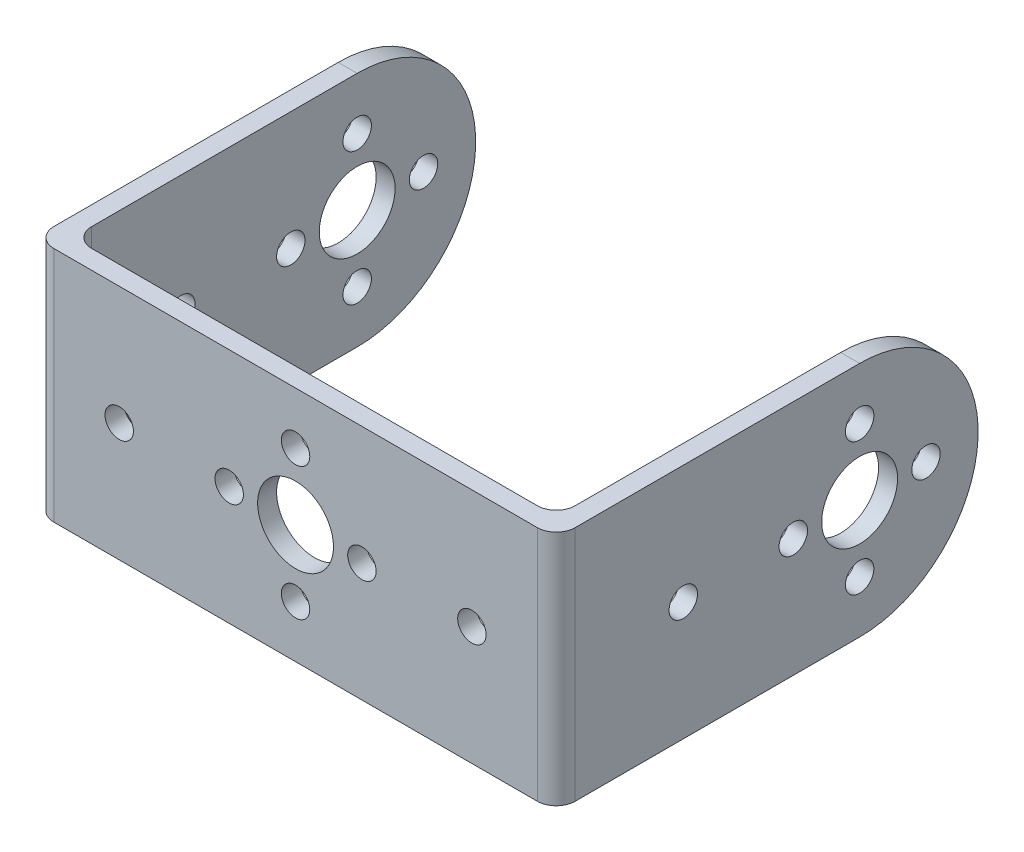
ISO-10303-21;
HEADER;
FILE_DESCRIPTION(('STEP AP214'),'2;1');
FILE_NAME('part.step','',(''),(''),'','','');
FILE_SCHEMA(('AUTOMOTIVE_DESIGN { 1 0 10303 214 1 1 1 1 }'));
ENDSEC;
DATA;
#1=APPLICATION_CONTEXT('core data for automotive mechanical design processes');
#2=APPLICATION_PROTOCOL_DEFINITION('international standard','automotive_design',2000,#1);
#3=PRODUCT_CONTEXT('',#1,'mechanical');
#4=PRODUCT('Part','Part','',(#3));
#5=PRODUCT_RELATED_PRODUCT_CATEGORY('part','',(#4));
#6=PRODUCT_DEFINITION_FORMATION('','',#4);
#7=PRODUCT_DEFINITION_CONTEXT('part definition',#1,'design');
#8=PRODUCT_DEFINITION('design','',#6,#7);
#9=PRODUCT_DEFINITION_SHAPE('','',#8);
#10=(LENGTH_UNIT() NAMED_UNIT(*) SI_UNIT(.MILLI.,.METRE.));
#11=(NAMED_UNIT(*) PLANE_ANGLE_UNIT() SI_UNIT($,.RADIAN.));
#12=(NAMED_UNIT(*) SI_UNIT($,.STERADIAN.) SOLID_ANGLE_UNIT());
#13=UNCERTAINTY_MEASURE_WITH_UNIT(LENGTH_MEASURE(1.E-05),#10,'distance_accuracy_value','');
#14=(GEOMETRIC_REPRESENTATION_CONTEXT(3) GLOBAL_UNCERTAINTY_ASSIGNED_CONTEXT((#13)) GLOBAL_UNIT_ASSIGNED_CONTEXT((#10,
#11,#12)) REPRESENTATION_CONTEXT('',''));
#15=CARTESIAN_POINT('',(0.,0.,0.));
#16=DIRECTION('',(0.,0.,1.));
#17=DIRECTION('',(1.,0.,0.));
#18=AXIS2_PLACEMENT_3D('',#15,#16,#17);
#19=CARTESIAN_POINT('',(-25.5,25.,-44.5));
#20=DIRECTION('',(1.,0.,0.));
#21=DIRECTION('',(0.,0.,-1.));
#22=AXIS2_PLACEMENT_3D('',#19,#20,#21);
#23=PLANE('',#22);
#24=CARTESIAN_POINT('',(-25.5,12.5,-32.));
#25=DIRECTION('',(1.,0.,0.));
#26=DIRECTION('',(0.,0.,-1.));
#27=AXIS2_PLACEMENT_3D('',#24,#25,#26);
#28=CIRCLE('',#27,4.00000000000001);
#29=CARTESIAN_POINT('',(-25.5,12.5,-36.));
#30=VERTEX_POINT('',#29);
#31=EDGE_CURVE('E322',#30,#30,#28,.F.);
#32=ORIENTED_EDGE('',*,*,#31,.T.);
#33=EDGE_LOOP('',(#32));
#34=FACE_BOUND('',#33,.T.);
#35=CARTESIAN_POINT('',(-25.5,19.5,-32.));
#36=DIRECTION('',(1.,0.,0.));
#37=DIRECTION('',(0.,0.,-1.));
#38=AXIS2_PLACEMENT_3D('',#35,#36,#37);
#39=CIRCLE('',#38,1.5);
#40=CARTESIAN_POINT('',(-25.5,19.5,-33.5));
#41=VERTEX_POINT('',#40);
#42=EDGE_CURVE('E319',#41,#41,#39,.F.);
#43=ORIENTED_EDGE('',*,*,#42,.T.);
#44=EDGE_LOOP('',(#43));
#45=FACE_BOUND('',#44,.T.);
#46=CARTESIAN_POINT('',(-25.5,12.5,-39.));
#47=DIRECTION('',(1.,0.,0.));
#48=DIRECTION('',(0.,0.,-1.));
#49=AXIS2_PLACEMENT_3D('',#46,#47,#48);
#50=CIRCLE('',#49,1.5);
#51=CARTESIAN_POINT('',(-25.5,12.5,-40.5));
#52=VERTEX_POINT('',#51);
#53=EDGE_CURVE('E316',#52,#52,#50,.F.);
#54=ORIENTED_EDGE('',*,*,#53,.T.);
#55=EDGE_LOOP('',(#54));
#56=FACE_BOUND('',#55,.T.);
#57=CARTESIAN_POINT('',(-25.5,5.5,-32.));
#58=DIRECTION('',(1.,0.,0.));
#59=DIRECTION('',(0.,0.,-1.));
#60=AXIS2_PLACEMENT_3D('',#57,#58,#59);
#61=CIRCLE('',#60,1.5);
#62=CARTESIAN_POINT('',(-25.5,5.5,-33.5));
#63=VERTEX_POINT('',#62);
#64=EDGE_CURVE('E299',#63,#63,#61,.F.);
#65=ORIENTED_EDGE('',*,*,#64,.T.);
#66=EDGE_LOOP('',(#65));
#67=FACE_BOUND('',#66,.T.);
#68=CARTESIAN_POINT('',(-25.5,12.5,-13.4));
#69=DIRECTION('',(1.,0.,0.));
#70=DIRECTION('',(0.,0.,-1.));
#71=AXIS2_PLACEMENT_3D('',#68,#69,#70);
#72=CIRCLE('',#71,1.5);
#73=CARTESIAN_POINT('',(-25.5,12.5,-14.9));
#74=VERTEX_POINT('',#73);
#75=EDGE_CURVE('E327',#74,#74,#72,.F.);
#76=ORIENTED_EDGE('',*,*,#75,.T.);
#77=EDGE_LOOP('',(#76));
#78=FACE_BOUND('',#77,.T.);
#79=CARTESIAN_POINT('',(-25.5,12.5,-25.));
#80=DIRECTION('',(1.,0.,0.));
#81=DIRECTION('',(0.,0.,-1.));
#82=AXIS2_PLACEMENT_3D('',#79,#80,#81);
#83=CIRCLE('',#82,1.5);
#84=CARTESIAN_POINT('',(-25.5,12.5,-26.5));
#85=VERTEX_POINT('',#84);
#86=EDGE_CURVE('E282',#85,#85,#83,.F.);
#87=ORIENTED_EDGE('',*,*,#86,.T.);
#88=EDGE_LOOP('',(#87));
#89=FACE_BOUND('',#88,.T.);
#90=DIRECTION('',(0.,0.,1.));
#91=VECTOR('',#90,1.);
#92=CARTESIAN_POINT('',(-25.5,25.,-44.5));
#93=LINE('',#92,#91);
#94=CARTESIAN_POINT('',(-25.5,25.,-32.));
#95=VERTEX_POINT('',#94);
#96=CARTESIAN_POINT('',(-25.5,25.,-4.));
#97=VERTEX_POINT('',#96);
#98=EDGE_CURVE('E273',#95,#97,#93,.T.);
#99=ORIENTED_EDGE('',*,*,#98,.T.);
#100=DIRECTION('',(0.,-1.,0.));
#101=VECTOR('',#100,1.);
#102=CARTESIAN_POINT('',(-25.5,25.,-4.));
#103=LINE('',#102,#101);
#104=CARTESIAN_POINT('',(-25.5,0.,-4.));
#105=VERTEX_POINT('',#104);
#106=EDGE_CURVE('E446',#97,#105,#103,.T.);
#107=ORIENTED_EDGE('',*,*,#106,.T.);
#108=DIRECTION('',(0.,0.,1.));
#109=VECTOR('',#108,1.);
#110=CARTESIAN_POINT('',(-25.5,0.,-44.5));
#111=LINE('',#110,#109);
#112=CARTESIAN_POINT('',(-25.5,0.,-32.));
#113=VERTEX_POINT('',#112);
#114=EDGE_CURVE('E330',#113,#105,#111,.T.);
#115=ORIENTED_EDGE('',*,*,#114,.F.);
#116=CARTESIAN_POINT('',(-25.5,12.5,-32.));
#117=DIRECTION('',(1.,0.,0.));
#118=DIRECTION('',(0.,0.,-1.));
#119=AXIS2_PLACEMENT_3D('',#116,#117,#118);
#120=CIRCLE('',#119,12.5);
#121=EDGE_CURVE('E325',#95,#113,#120,.F.);
#122=ORIENTED_EDGE('',*,*,#121,.F.);
#123=EDGE_LOOP('',(#99,#107,#115,#122));
#124=FACE_BOUND('',#123,.T.);
#125=ADVANCED_FACE('F178',(#34,#45,#56,#67,#78,#89,#124),#23,.T.);
#126=CARTESIAN_POINT('',(-27.5,25.,0.));
#127=DIRECTION('',(-1.,0.,0.));
#128=DIRECTION('',(0.,0.,1.));
#129=AXIS2_PLACEMENT_3D('',#126,#127,#128);
#130=PLANE('',#129);
#131=CARTESIAN_POINT('',(-27.5,12.5,-32.));
#132=DIRECTION('',(1.,0.,0.));
#133=DIRECTION('',(0.,0.,-1.));
#134=AXIS2_PLACEMENT_3D('',#131,#132,#133);
#135=CIRCLE('',#134,4.00000000000001);
#136=CARTESIAN_POINT('',(-27.5,12.5,-36.));
#137=VERTEX_POINT('',#136);
#138=EDGE_CURVE('E300',#137,#137,#135,.T.);
#139=ORIENTED_EDGE('',*,*,#138,.T.);
#140=EDGE_LOOP('',(#139));
#141=FACE_BOUND('',#140,.T.);
#142=CARTESIAN_POINT('',(-27.5,19.5,-32.));
#143=DIRECTION('',(1.,0.,0.));
#144=DIRECTION('',(0.,0.,-1.));
#145=AXIS2_PLACEMENT_3D('',#142,#143,#144);
#146=CIRCLE('',#145,1.5);
#147=CARTESIAN_POINT('',(-27.5,19.5,-33.5));
#148=VERTEX_POINT('',#147);
#149=EDGE_CURVE('E307',#148,#148,#146,.T.);
#150=ORIENTED_EDGE('',*,*,#149,.T.);
#151=EDGE_LOOP('',(#150));
#152=FACE_BOUND('',#151,.T.);
#153=CARTESIAN_POINT('',(-27.5,12.5,-39.));
#154=DIRECTION('',(1.,0.,0.));
#155=DIRECTION('',(0.,0.,-1.));
#156=AXIS2_PLACEMENT_3D('',#153,#154,#155);
#157=CIRCLE('',#156,1.5);
#158=CARTESIAN_POINT('',(-27.5,12.5,-40.5));
#159=VERTEX_POINT('',#158);
#160=EDGE_CURVE('E304',#159,#159,#157,.T.);
#161=ORIENTED_EDGE('',*,*,#160,.T.);
#162=EDGE_LOOP('',(#161));
#163=FACE_BOUND('',#162,.T.);
#164=CARTESIAN_POINT('',(-27.5,5.5,-32.));
#165=DIRECTION('',(1.,0.,0.));
#166=DIRECTION('',(0.,0.,-1.));
#167=AXIS2_PLACEMENT_3D('',#164,#165,#166);
#168=CIRCLE('',#167,1.5);
#169=CARTESIAN_POINT('',(-27.5,5.5,-33.5));
#170=VERTEX_POINT('',#169);
#171=EDGE_CURVE('E303',#170,#170,#168,.T.);
#172=ORIENTED_EDGE('',*,*,#171,.T.);
#173=EDGE_LOOP('',(#172));
#174=FACE_BOUND('',#173,.T.);
#175=CARTESIAN_POINT('',(-27.5,12.5,-13.4));
#176=DIRECTION('',(1.,0.,0.));
#177=DIRECTION('',(0.,0.,-1.));
#178=AXIS2_PLACEMENT_3D('',#175,#176,#177);
#179=CIRCLE('',#178,1.5);
#180=CARTESIAN_POINT('',(-27.5,12.5,-14.9));
#181=VERTEX_POINT('',#180);
#182=EDGE_CURVE('E297',#181,#181,#179,.T.);
#183=ORIENTED_EDGE('',*,*,#182,.T.);
#184=EDGE_LOOP('',(#183));
#185=FACE_BOUND('',#184,.T.);
#186=CARTESIAN_POINT('',(-27.5,12.5,-25.));
#187=DIRECTION('',(1.,0.,0.));
#188=DIRECTION('',(0.,0.,-1.));
#189=AXIS2_PLACEMENT_3D('',#186,#187,#188);
#190=CIRCLE('',#189,1.5);
#191=CARTESIAN_POINT('',(-27.5,12.5,-26.5));
#192=VERTEX_POINT('',#191);
#193=EDGE_CURVE('E286',#192,#192,#190,.T.);
#194=ORIENTED_EDGE('',*,*,#193,.T.);
#195=EDGE_LOOP('',(#194));
#196=FACE_BOUND('',#195,.T.);
#197=DIRECTION('',(0.,0.,-1.));
#198=VECTOR('',#197,1.);
#199=CARTESIAN_POINT('',(-27.5,0.,0.));
#200=LINE('',#199,#198);
#201=CARTESIAN_POINT('',(-27.5,0.,-2.));
#202=VERTEX_POINT('',#201);
#203=CARTESIAN_POINT('',(-27.5,0.,-32.));
#204=VERTEX_POINT('',#203);
#205=EDGE_CURVE('E331',#202,#204,#200,.T.);
#206=ORIENTED_EDGE('',*,*,#205,.F.);
#207=DIRECTION('',(0.,-1.,0.));
#208=VECTOR('',#207,1.);
#209=CARTESIAN_POINT('',(-27.5,25.,-2.));
#210=LINE('',#209,#208);
#211=CARTESIAN_POINT('',(-27.5,25.,-2.));
#212=VERTEX_POINT('',#211);
#213=EDGE_CURVE('E199',#202,#212,#210,.F.);
#214=ORIENTED_EDGE('',*,*,#213,.T.);
#215=DIRECTION('',(0.,0.,-1.));
#216=VECTOR('',#215,1.);
#217=CARTESIAN_POINT('',(-27.5,25.,0.));
#218=LINE('',#217,#216);
#219=CARTESIAN_POINT('',(-27.5,25.,-32.));
#220=VERTEX_POINT('',#219);
#221=EDGE_CURVE('E266',#212,#220,#218,.T.);
#222=ORIENTED_EDGE('',*,*,#221,.T.);
#223=CARTESIAN_POINT('',(-27.5,12.5,-32.));
#224=DIRECTION('',(1.,0.,0.));
#225=DIRECTION('',(0.,0.,-1.));
#226=AXIS2_PLACEMENT_3D('',#223,#224,#225);
#227=CIRCLE('',#226,12.5);
#228=EDGE_CURVE('E269',#204,#220,#227,.T.);
#229=ORIENTED_EDGE('',*,*,#228,.F.);
#230=EDGE_LOOP('',(#206,#214,#222,#229));
#231=FACE_BOUND('',#230,.T.);
#232=ADVANCED_FACE('F268',(#141,#152,#163,#174,#185,#196,#231),#130,.T.);
#233=CARTESIAN_POINT('',(27.5,25.,0.));
#234=DIRECTION('',(-1.,0.,0.));
#235=DIRECTION('',(0.,0.,1.));
#236=AXIS2_PLACEMENT_3D('',#233,#234,#235);
#237=PLANE('',#236);
#238=CARTESIAN_POINT('',(27.5,12.5,-32.));
#239=DIRECTION('',(1.,0.,0.));
#240=DIRECTION('',(0.,0.,-1.));
#241=AXIS2_PLACEMENT_3D('',#238,#239,#240);
#242=CIRCLE('',#241,4.00000000000001);
#243=CARTESIAN_POINT('',(27.5,12.5,-36.));
#244=VERTEX_POINT('',#243);
#245=EDGE_CURVE('E343',#244,#244,#242,.T.);
#246=ORIENTED_EDGE('',*,*,#245,.F.);
#247=EDGE_LOOP('',(#246));
#248=FACE_BOUND('',#247,.T.);
#249=CARTESIAN_POINT('',(27.5,19.5,-32.));
#250=DIRECTION('',(1.,0.,0.));
#251=DIRECTION('',(0.,0.,-1.));
#252=AXIS2_PLACEMENT_3D('',#249,#250,#251);
#253=CIRCLE('',#252,1.5);
#254=CARTESIAN_POINT('',(27.5,19.5,-33.5));
#255=VERTEX_POINT('',#254);
#256=EDGE_CURVE('E351',#255,#255,#253,.T.);
#257=ORIENTED_EDGE('',*,*,#256,.F.);
#258=EDGE_LOOP('',(#257));
#259=FACE_BOUND('',#258,.T.);
#260=CARTESIAN_POINT('',(27.5,12.5,-39.));
#261=DIRECTION('',(1.,0.,0.));
#262=DIRECTION('',(0.,0.,-1.));
#263=AXIS2_PLACEMENT_3D('',#260,#261,#262);
#264=CIRCLE('',#263,1.5);
#265=CARTESIAN_POINT('',(27.5,12.5,-40.5));
#266=VERTEX_POINT('',#265);
#267=EDGE_CURVE('E348',#266,#266,#264,.T.);
#268=ORIENTED_EDGE('',*,*,#267,.F.);
#269=EDGE_LOOP('',(#268));
#270=FACE_BOUND('',#269,.T.);
#271=CARTESIAN_POINT('',(27.5,5.5,-32.));
#272=DIRECTION('',(1.,0.,0.));
#273=DIRECTION('',(0.,0.,-1.));
#274=AXIS2_PLACEMENT_3D('',#271,#272,#273);
#275=CIRCLE('',#274,1.5);
#276=CARTESIAN_POINT('',(27.5,5.5,-33.5));
#277=VERTEX_POINT('',#276);
#278=EDGE_CURVE('E347',#277,#277,#275,.T.);
#279=ORIENTED_EDGE('',*,*,#278,.F.);
#280=EDGE_LOOP('',(#279));
#281=FACE_BOUND('',#280,.T.);
#282=CARTESIAN_POINT('',(27.5,12.5,-13.4));
#283=DIRECTION('',(1.,0.,0.));
#284=DIRECTION('',(0.,0.,-1.));
#285=AXIS2_PLACEMENT_3D('',#282,#283,#284);
#286=CIRCLE('',#285,1.5);
#287=CARTESIAN_POINT('',(27.5,12.5,-14.9));
#288=VERTEX_POINT('',#287);
#289=EDGE_CURVE('E339',#288,#288,#286,.T.);
#290=ORIENTED_EDGE('',*,*,#289,.F.);
#291=EDGE_LOOP('',(#290));
#292=FACE_BOUND('',#291,.T.);
#293=CARTESIAN_POINT('',(27.5,12.5,-25.));
#294=DIRECTION('',(1.,0.,0.));
#295=DIRECTION('',(0.,0.,-1.));
#296=AXIS2_PLACEMENT_3D('',#293,#294,#295);
#297=CIRCLE('',#296,1.5);
#298=CARTESIAN_POINT('',(27.5,12.5,-26.5));
#299=VERTEX_POINT('',#298);
#300=EDGE_CURVE('E272',#299,#299,#297,.T.);
#301=ORIENTED_EDGE('',*,*,#300,.F.);
#302=EDGE_LOOP('',(#301));
#303=FACE_BOUND('',#302,.T.);
#304=DIRECTION('',(0.,0.,-1.));
#305=VECTOR('',#304,1.);
#306=CARTESIAN_POINT('',(27.5,25.,0.));
#307=LINE('',#306,#305);
#308=CARTESIAN_POINT('',(27.5,25.,-2.));
#309=VERTEX_POINT('',#308);
#310=CARTESIAN_POINT('',(27.5,25.,-32.));
#311=VERTEX_POINT('',#310);
#312=EDGE_CURVE('E362',#309,#311,#307,.T.);
#313=ORIENTED_EDGE('',*,*,#312,.F.);
#314=DIRECTION('',(0.,-1.,0.));
#315=VECTOR('',#314,1.);
#316=CARTESIAN_POINT('',(27.5,25.,-2.));
#317=LINE('',#316,#315);
#318=CARTESIAN_POINT('',(27.5,0.,-2.));
#319=VERTEX_POINT('',#318);
#320=EDGE_CURVE('E430',#309,#319,#317,.T.);
#321=ORIENTED_EDGE('',*,*,#320,.T.);
#322=DIRECTION('',(0.,0.,-1.));
#323=VECTOR('',#322,1.);
#324=CARTESIAN_POINT('',(27.5,0.,0.));
#325=LINE('',#324,#323);
#326=CARTESIAN_POINT('',(27.5,0.,-32.));
#327=VERTEX_POINT('',#326);
#328=EDGE_CURVE('E374',#319,#327,#325,.T.);
#329=ORIENTED_EDGE('',*,*,#328,.T.);
#330=CARTESIAN_POINT('',(27.5,12.5,-32.));
#331=DIRECTION('',(1.,0.,0.));
#332=DIRECTION('',(0.,0.,-1.));
#333=AXIS2_PLACEMENT_3D('',#330,#331,#332);
#334=CIRCLE('',#333,12.5);
#335=EDGE_CURVE('E344',#327,#311,#334,.T.);
#336=ORIENTED_EDGE('',*,*,#335,.T.);
#337=EDGE_LOOP('',(#313,#321,#329,#336));
#338=FACE_BOUND('',#337,.T.);
#339=ADVANCED_FACE('F481',(#248,#259,#270,#281,#292,#303,#338),#237,.F.);
#340=CARTESIAN_POINT('',(25.5,25.,-44.5));
#341=DIRECTION('',(1.,0.,0.));
#342=DIRECTION('',(0.,0.,-1.));
#343=AXIS2_PLACEMENT_3D('',#340,#341,#342);
#344=PLANE('',#343);
#345=CARTESIAN_POINT('',(25.5,12.5,-32.));
#346=DIRECTION('',(1.,0.,0.));
#347=DIRECTION('',(0.,0.,-1.));
#348=AXIS2_PLACEMENT_3D('',#345,#346,#347);
#349=CIRCLE('',#348,4.00000000000001);
#350=CARTESIAN_POINT('',(25.5,12.5,-36.));
#351=VERTEX_POINT('',#350);
#352=EDGE_CURVE('E393',#351,#351,#349,.T.);
#353=ORIENTED_EDGE('',*,*,#352,.T.);
#354=EDGE_LOOP('',(#353));
#355=FACE_BOUND('',#354,.T.);
#356=CARTESIAN_POINT('',(25.5,19.5,-32.));
#357=DIRECTION('',(1.,0.,0.));
#358=DIRECTION('',(0.,0.,-1.));
#359=AXIS2_PLACEMENT_3D('',#356,#357,#358);
#360=CIRCLE('',#359,1.5);
#361=CARTESIAN_POINT('',(25.5,19.5,-33.5));
#362=VERTEX_POINT('',#361);
#363=EDGE_CURVE('E390',#362,#362,#360,.T.);
#364=ORIENTED_EDGE('',*,*,#363,.T.);
#365=EDGE_LOOP('',(#364));
#366=FACE_BOUND('',#365,.T.);
#367=CARTESIAN_POINT('',(25.5,12.5,-39.));
#368=DIRECTION('',(1.,0.,0.));
#369=DIRECTION('',(0.,0.,-1.));
#370=AXIS2_PLACEMENT_3D('',#367,#368,#369);
#371=CIRCLE('',#370,1.5);
#372=CARTESIAN_POINT('',(25.5,12.5,-40.5));
#373=VERTEX_POINT('',#372);
#374=EDGE_CURVE('E387',#373,#373,#371,.T.);
#375=ORIENTED_EDGE('',*,*,#374,.T.);
#376=EDGE_LOOP('',(#375));
#377=FACE_BOUND('',#376,.T.);
#378=CARTESIAN_POINT('',(25.5,5.5,-32.));
#379=DIRECTION('',(1.,0.,0.));
#380=DIRECTION('',(0.,0.,-1.));
#381=AXIS2_PLACEMENT_3D('',#378,#379,#380);
#382=CIRCLE('',#381,1.5);
#383=CARTESIAN_POINT('',(25.5,5.5,-33.5));
#384=VERTEX_POINT('',#383);
#385=EDGE_CURVE('E359',#384,#384,#382,.T.);
#386=ORIENTED_EDGE('',*,*,#385,.T.);
#387=EDGE_LOOP('',(#386));
#388=FACE_BOUND('',#387,.T.);
#389=CARTESIAN_POINT('',(25.5,12.5,-13.4));
#390=DIRECTION('',(1.,0.,0.));
#391=DIRECTION('',(0.,0.,-1.));
#392=AXIS2_PLACEMENT_3D('',#389,#390,#391);
#393=CIRCLE('',#392,1.5);
#394=CARTESIAN_POINT('',(25.5,12.5,-14.9));
#395=VERTEX_POINT('',#394);
#396=EDGE_CURVE('E375',#395,#395,#393,.T.);
#397=ORIENTED_EDGE('',*,*,#396,.T.);
#398=EDGE_LOOP('',(#397));
#399=FACE_BOUND('',#398,.T.);
#400=CARTESIAN_POINT('',(25.5,12.5,-25.));
#401=DIRECTION('',(1.,0.,0.));
#402=DIRECTION('',(0.,0.,-1.));
#403=AXIS2_PLACEMENT_3D('',#400,#401,#402);
#404=CIRCLE('',#403,1.5);
#405=CARTESIAN_POINT('',(25.5,12.5,-26.5));
#406=VERTEX_POINT('',#405);
#407=EDGE_CURVE('E338',#406,#406,#404,.T.);
#408=ORIENTED_EDGE('',*,*,#407,.T.);
#409=EDGE_LOOP('',(#408));
#410=FACE_BOUND('',#409,.T.);
#411=DIRECTION('',(0.,0.,1.));
#412=VECTOR('',#411,1.);
#413=CARTESIAN_POINT('',(25.5,0.,-44.5));
#414=LINE('',#413,#412);
#415=CARTESIAN_POINT('',(25.5,0.,-32.));
#416=VERTEX_POINT('',#415);
#417=CARTESIAN_POINT('',(25.5,0.,-4.));
#418=VERTEX_POINT('',#417);
#419=EDGE_CURVE('E377',#416,#418,#414,.T.);
#420=ORIENTED_EDGE('',*,*,#419,.T.);
#421=DIRECTION('',(0.,-1.,0.));
#422=VECTOR('',#421,1.);
#423=CARTESIAN_POINT('',(25.5,25.,-4.));
#424=LINE('',#423,#422);
#425=CARTESIAN_POINT('',(25.5,25.,-4.));
#426=VERTEX_POINT('',#425);
#427=EDGE_CURVE('E428',#418,#426,#424,.F.);
#428=ORIENTED_EDGE('',*,*,#427,.T.);
#429=DIRECTION('',(0.,0.,1.));
#430=VECTOR('',#429,1.);
#431=CARTESIAN_POINT('',(25.5,25.,-44.5));
#432=LINE('',#431,#430);
#433=CARTESIAN_POINT('',(25.5,25.,-32.));
#434=VERTEX_POINT('',#433);
#435=EDGE_CURVE('E365',#434,#426,#432,.T.);
#436=ORIENTED_EDGE('',*,*,#435,.F.);
#437=CARTESIAN_POINT('',(25.5,12.5,-32.));
#438=DIRECTION('',(1.,0.,0.));
#439=DIRECTION('',(0.,0.,-1.));
#440=AXIS2_PLACEMENT_3D('',#437,#438,#439);
#441=CIRCLE('',#440,12.5);
#442=EDGE_CURVE('E342',#416,#434,#441,.T.);
#443=ORIENTED_EDGE('',*,*,#442,.F.);
#444=EDGE_LOOP('',(#420,#428,#436,#443));
#445=FACE_BOUND('',#444,.T.);
#446=ADVANCED_FACE('F489',(#355,#366,#377,#388,#399,#410,#445),#344,.F.);
#447=CARTESIAN_POINT('',(0.,25.,0.));
#448=DIRECTION('',(0.,0.,-1.));
#449=DIRECTION('',(-1.,0.,0.));
#450=AXIS2_PLACEMENT_3D('',#447,#448,#449);
#451=PLANE('',#450);
#452=CARTESIAN_POINT('',(0.,19.5,0.));
#453=DIRECTION('',(0.,0.,1.));
#454=DIRECTION('',(1.,0.,0.));
#455=AXIS2_PLACEMENT_3D('',#452,#453,#454);
#456=CIRCLE('',#455,1.5);
#457=CARTESIAN_POINT('',(1.5,19.5,0.));
#458=VERTEX_POINT('',#457);
#459=EDGE_CURVE('E407',#458,#458,#456,.T.);
#460=ORIENTED_EDGE('',*,*,#459,.F.);
#461=EDGE_LOOP('',(#460));
#462=FACE_BOUND('',#461,.T.);
#463=CARTESIAN_POINT('',(18.6,12.5,0.));
#464=DIRECTION('',(0.,0.,1.));
#465=DIRECTION('',(1.,0.,0.));
#466=AXIS2_PLACEMENT_3D('',#463,#464,#465);
#467=CIRCLE('',#466,1.5);
#468=CARTESIAN_POINT('',(20.1,12.5,0.));
#469=VERTEX_POINT('',#468);
#470=EDGE_CURVE('E566',#469,#469,#467,.T.);
#471=ORIENTED_EDGE('',*,*,#470,.F.);
#472=EDGE_LOOP('',(#471));
#473=FACE_BOUND('',#472,.T.);
#474=CARTESIAN_POINT('',(0.,12.5,0.));
#475=DIRECTION('',(0.,0.,1.));
#476=DIRECTION('',(1.,0.,0.));
#477=AXIS2_PLACEMENT_3D('',#474,#475,#476);
#478=CIRCLE('',#477,4.);
#479=CARTESIAN_POINT('',(4.,12.5,0.));
#480=VERTEX_POINT('',#479);
#481=EDGE_CURVE('E570',#480,#480,#478,.T.);
#482=ORIENTED_EDGE('',*,*,#481,.F.);
#483=EDGE_LOOP('',(#482));
#484=FACE_BOUND('',#483,.T.);
#485=CARTESIAN_POINT('',(-18.6,12.5,0.));
#486=DIRECTION('',(0.,0.,1.));
#487=DIRECTION('',(1.,0.,0.));
#488=AXIS2_PLACEMENT_3D('',#485,#486,#487);
#489=CIRCLE('',#488,1.5);
#490=CARTESIAN_POINT('',(-17.1,12.5,0.));
#491=VERTEX_POINT('',#490);
#492=EDGE_CURVE('E294',#491,#491,#489,.T.);
#493=ORIENTED_EDGE('',*,*,#492,.F.);
#494=EDGE_LOOP('',(#493));
#495=FACE_BOUND('',#494,.T.);
#496=CARTESIAN_POINT('',(-7.,12.5,0.));
#497=DIRECTION('',(0.,0.,1.));
#498=DIRECTION('',(1.,0.,0.));
#499=AXIS2_PLACEMENT_3D('',#496,#497,#498);
#500=CIRCLE('',#499,1.5);
#501=CARTESIAN_POINT('',(-5.5,12.5,0.));
#502=VERTEX_POINT('',#501);
#503=EDGE_CURVE('E577',#502,#502,#500,.T.);
#504=ORIENTED_EDGE('',*,*,#503,.F.);
#505=EDGE_LOOP('',(#504));
#506=FACE_BOUND('',#505,.T.);
#507=CARTESIAN_POINT('',(0.,5.5,0.));
#508=DIRECTION('',(0.,0.,1.));
#509=DIRECTION('',(1.,0.,0.));
#510=AXIS2_PLACEMENT_3D('',#507,#508,#509);
#511=CIRCLE('',#510,1.5);
#512=CARTESIAN_POINT('',(1.5,5.5,0.));
#513=VERTEX_POINT('',#512);
#514=EDGE_CURVE('E581',#513,#513,#511,.T.);
#515=ORIENTED_EDGE('',*,*,#514,.F.);
#516=EDGE_LOOP('',(#515));
#517=FACE_BOUND('',#516,.T.);
#518=CARTESIAN_POINT('',(7.,12.5,0.));
#519=DIRECTION('',(0.,0.,1.));
#520=DIRECTION('',(1.,0.,0.));
#521=AXIS2_PLACEMENT_3D('',#518,#519,#520);
#522=CIRCLE('',#521,1.5);
#523=CARTESIAN_POINT('',(8.5,12.5,0.));
#524=VERTEX_POINT('',#523);
#525=EDGE_CURVE('E584',#524,#524,#522,.T.);
#526=ORIENTED_EDGE('',*,*,#525,.F.);
#527=EDGE_LOOP('',(#526));
#528=FACE_BOUND('',#527,.T.);
#529=DIRECTION('',(1.,0.,0.));
#530=VECTOR('',#529,1.);
#531=CARTESIAN_POINT('',(0.,0.,0.));
#532=LINE('',#531,#530);
#533=CARTESIAN_POINT('',(-25.5,0.,0.));
#534=VERTEX_POINT('',#533);
#535=CARTESIAN_POINT('',(25.5,0.,0.));
#536=VERTEX_POINT('',#535);
#537=EDGE_CURVE('E371',#534,#536,#532,.T.);
#538=ORIENTED_EDGE('',*,*,#537,.T.);
#539=DIRECTION('',(0.,-1.,0.));
#540=VECTOR('',#539,1.);
#541=CARTESIAN_POINT('',(25.5,25.,0.));
#542=LINE('',#541,#540);
#543=CARTESIAN_POINT('',(25.5,25.,0.));
#544=VERTEX_POINT('',#543);
#545=EDGE_CURVE('E440',#536,#544,#542,.F.);
#546=ORIENTED_EDGE('',*,*,#545,.T.);
#547=DIRECTION('',(1.,0.,0.));
#548=VECTOR('',#547,1.);
#549=CARTESIAN_POINT('',(0.,25.,0.));
#550=LINE('',#549,#548);
#551=CARTESIAN_POINT('',(-25.5,25.,0.));
#552=VERTEX_POINT('',#551);
#553=EDGE_CURVE('E360',#552,#544,#550,.T.);
#554=ORIENTED_EDGE('',*,*,#553,.F.);
#555=DIRECTION('',(0.,-1.,0.));
#556=VECTOR('',#555,1.);
#557=CARTESIAN_POINT('',(-25.5,0.,0.));
#558=LINE('',#557,#556);
#559=EDGE_CURVE('E437',#552,#534,#558,.T.);
#560=ORIENTED_EDGE('',*,*,#559,.T.);
#561=EDGE_LOOP('',(#538,#546,#554,#560));
#562=FACE_BOUND('',#561,.T.);
#563=ADVANCED_FACE('F473',(#462,#473,#484,#495,#506,#517,#528,#562),#451,.F.);
#564=CARTESIAN_POINT('',(25.5,25.,-2.));
#565=DIRECTION('',(0.,0.,1.));
#566=DIRECTION('',(1.,0.,0.));
#567=AXIS2_PLACEMENT_3D('',#564,#565,#566);
#568=PLANE('',#567);
#569=CARTESIAN_POINT('',(0.,19.5,-2.));
#570=DIRECTION('',(0.,0.,1.));
#571=DIRECTION('',(1.,0.,0.));
#572=AXIS2_PLACEMENT_3D('',#569,#570,#571);
#573=CIRCLE('',#572,1.5);
#574=CARTESIAN_POINT('',(1.5,19.5,-2.));
#575=VERTEX_POINT('',#574);
#576=EDGE_CURVE('E291',#575,#575,#573,.T.);
#577=ORIENTED_EDGE('',*,*,#576,.T.);
#578=EDGE_LOOP('',(#577));
#579=FACE_BOUND('',#578,.T.);
#580=CARTESIAN_POINT('',(18.6,12.5,-2.));
#581=DIRECTION('',(0.,0.,1.));
#582=DIRECTION('',(1.,0.,0.));
#583=AXIS2_PLACEMENT_3D('',#580,#581,#582);
#584=CIRCLE('',#583,1.5);
#585=CARTESIAN_POINT('',(20.1,12.5,-2.));
#586=VERTEX_POINT('',#585);
#587=EDGE_CURVE('E419',#586,#586,#584,.T.);
#588=ORIENTED_EDGE('',*,*,#587,.T.);
#589=EDGE_LOOP('',(#588));
#590=FACE_BOUND('',#589,.T.);
#591=CARTESIAN_POINT('',(0.,12.5,-2.));
#592=DIRECTION('',(0.,0.,1.));
#593=DIRECTION('',(1.,0.,0.));
#594=AXIS2_PLACEMENT_3D('',#591,#592,#593);
#595=CIRCLE('',#594,4.);
#596=CARTESIAN_POINT('',(4.,12.5,-2.));
#597=VERTEX_POINT('',#596);
#598=EDGE_CURVE('E416',#597,#597,#595,.T.);
#599=ORIENTED_EDGE('',*,*,#598,.T.);
#600=EDGE_LOOP('',(#599));
#601=FACE_BOUND('',#600,.T.);
#602=CARTESIAN_POINT('',(-18.6,12.5,-1.99999999999999));
#603=DIRECTION('',(0.,0.,1.));
#604=DIRECTION('',(1.,0.,0.));
#605=AXIS2_PLACEMENT_3D('',#602,#603,#604);
#606=CIRCLE('',#605,1.5);
#607=CARTESIAN_POINT('',(-17.1,12.5,-1.99999999999999));
#608=VERTEX_POINT('',#607);
#609=EDGE_CURVE('E413',#608,#608,#606,.T.);
#610=ORIENTED_EDGE('',*,*,#609,.T.);
#611=EDGE_LOOP('',(#610));
#612=FACE_BOUND('',#611,.T.);
#613=CARTESIAN_POINT('',(-7.,12.5,-2.));
#614=DIRECTION('',(0.,0.,1.));
#615=DIRECTION('',(1.,0.,0.));
#616=AXIS2_PLACEMENT_3D('',#613,#614,#615);
#617=CIRCLE('',#616,1.5);
#618=CARTESIAN_POINT('',(-5.5,12.5,-2.));
#619=VERTEX_POINT('',#618);
#620=EDGE_CURVE('E410',#619,#619,#617,.T.);
#621=ORIENTED_EDGE('',*,*,#620,.T.);
#622=EDGE_LOOP('',(#621));
#623=FACE_BOUND('',#622,.T.);
#624=CARTESIAN_POINT('',(0.,5.5,-2.));
#625=DIRECTION('',(0.,0.,1.));
#626=DIRECTION('',(1.,0.,0.));
#627=AXIS2_PLACEMENT_3D('',#624,#625,#626);
#628=CIRCLE('',#627,1.5);
#629=CARTESIAN_POINT('',(1.5,5.5,-2.));
#630=VERTEX_POINT('',#629);
#631=EDGE_CURVE('E406',#630,#630,#628,.T.);
#632=ORIENTED_EDGE('',*,*,#631,.T.);
#633=EDGE_LOOP('',(#632));
#634=FACE_BOUND('',#633,.T.);
#635=CARTESIAN_POINT('',(7.,12.5,-2.));
#636=DIRECTION('',(0.,0.,1.));
#637=DIRECTION('',(1.,0.,0.));
#638=AXIS2_PLACEMENT_3D('',#635,#636,#637);
#639=CIRCLE('',#638,1.5);
#640=CARTESIAN_POINT('',(8.5,12.5,-2.));
#641=VERTEX_POINT('',#640);
#642=EDGE_CURVE('E403',#641,#641,#639,.T.);
#643=ORIENTED_EDGE('',*,*,#642,.T.);
#644=EDGE_LOOP('',(#643));
#645=FACE_BOUND('',#644,.T.);
#646=DIRECTION('',(-1.,0.,0.));
#647=VECTOR('',#646,1.);
#648=CARTESIAN_POINT('',(25.5,25.,-2.));
#649=LINE('',#648,#647);
#650=CARTESIAN_POINT('',(23.5,25.,-2.));
#651=VERTEX_POINT('',#650);
#652=CARTESIAN_POINT('',(-23.5,25.,-2.));
#653=VERTEX_POINT('',#652);
#654=EDGE_CURVE('E368',#651,#653,#649,.T.);
#655=ORIENTED_EDGE('',*,*,#654,.F.);
#656=DIRECTION('',(0.,-1.,0.));
#657=VECTOR('',#656,1.);
#658=CARTESIAN_POINT('',(23.5,0.,-2.));
#659=LINE('',#658,#657);
#660=CARTESIAN_POINT('',(23.5,0.,-2.));
#661=VERTEX_POINT('',#660);
#662=EDGE_CURVE('E425',#651,#661,#659,.T.);
#663=ORIENTED_EDGE('',*,*,#662,.T.);
#664=DIRECTION('',(-1.,0.,0.));
#665=VECTOR('',#664,1.);
#666=CARTESIAN_POINT('',(25.5,0.,-2.));
#667=LINE('',#666,#665);
#668=CARTESIAN_POINT('',(-23.5,0.,-2.));
#669=VERTEX_POINT('',#668);
#670=EDGE_CURVE('E363',#661,#669,#667,.T.);
#671=ORIENTED_EDGE('',*,*,#670,.T.);
#672=DIRECTION('',(0.,-1.,0.));
#673=VECTOR('',#672,1.);
#674=CARTESIAN_POINT('',(-23.5,25.,-2.));
#675=LINE('',#674,#673);
#676=EDGE_CURVE('E400',#669,#653,#675,.F.);
#677=ORIENTED_EDGE('',*,*,#676,.T.);
#678=EDGE_LOOP('',(#655,#663,#671,#677));
#679=FACE_BOUND('',#678,.T.);
#680=ADVANCED_FACE('F463',(#579,#590,#601,#612,#623,#634,#645,#679),#568,.F.);
#681=CARTESIAN_POINT('',(0.,25.,0.));
#682=DIRECTION('',(0.,1.,0.));
#683=DIRECTION('',(0.,0.,1.));
#684=AXIS2_PLACEMENT_3D('',#681,#682,#683);
#685=PLANE('',#684);
#686=ORIENTED_EDGE('',*,*,#553,.T.);
#687=CARTESIAN_POINT('',(25.5,25.,-2.));
#688=DIRECTION('',(0.,1.,0.));
#689=DIRECTION('',(0.,0.,1.));
#690=AXIS2_PLACEMENT_3D('',#687,#688,#689);
#691=CIRCLE('',#690,2.);
#692=EDGE_CURVE('E444',#544,#309,#691,.T.);
#693=ORIENTED_EDGE('',*,*,#692,.T.);
#694=ORIENTED_EDGE('',*,*,#312,.T.);
#695=DIRECTION('',(1.,0.,0.));
#696=VECTOR('',#695,1.);
#697=CARTESIAN_POINT('',(2.5,25.,-32.));
#698=LINE('',#697,#696);
#699=EDGE_CURVE('E370',#434,#311,#698,.T.);
#700=ORIENTED_EDGE('',*,*,#699,.F.);
#701=ORIENTED_EDGE('',*,*,#435,.T.);
#702=CARTESIAN_POINT('',(23.5,25.,-4.));
#703=DIRECTION('',(0.,1.,0.));
#704=DIRECTION('',(0.,0.,1.));
#705=AXIS2_PLACEMENT_3D('',#702,#703,#704);
#706=CIRCLE('',#705,2.);
#707=EDGE_CURVE('E452',#426,#651,#706,.F.);
#708=ORIENTED_EDGE('',*,*,#707,.T.);
#709=ORIENTED_EDGE('',*,*,#654,.T.);
#710=CARTESIAN_POINT('',(-23.5,25.,-4.));
#711=DIRECTION('',(0.,1.,0.));
#712=DIRECTION('',(0.,0.,1.));
#713=AXIS2_PLACEMENT_3D('',#710,#711,#712);
#714=CIRCLE('',#713,2.);
#715=EDGE_CURVE('E12',#653,#97,#714,.F.);
#716=ORIENTED_EDGE('',*,*,#715,.T.);
#717=ORIENTED_EDGE('',*,*,#98,.F.);
#718=DIRECTION('',(-1.,0.,0.));
#719=VECTOR('',#718,1.);
#720=CARTESIAN_POINT('',(-2.5,25.,-32.));
#721=LINE('',#720,#719);
#722=EDGE_CURVE('E279',#95,#220,#721,.T.);
#723=ORIENTED_EDGE('',*,*,#722,.T.);
#724=ORIENTED_EDGE('',*,*,#221,.F.);
#725=CARTESIAN_POINT('',(-25.5,25.,-2.));
#726=DIRECTION('',(0.,1.,0.));
#727=DIRECTION('',(0.,0.,1.));
#728=AXIS2_PLACEMENT_3D('',#725,#726,#727);
#729=CIRCLE('',#728,2.);
#730=EDGE_CURVE('E442',#212,#552,#729,.T.);
#731=ORIENTED_EDGE('',*,*,#730,.T.);
#732=EDGE_LOOP('',(#686,#693,#694,#700,#701,#708,#709,#716,#717,#723,#724,#731));
#733=FACE_BOUND('',#732,.T.);
#734=ADVANCED_FACE('F285',(#733),#685,.T.);
#735=CARTESIAN_POINT('',(0.,0.,0.));
#736=DIRECTION('',(0.,1.,0.));
#737=DIRECTION('',(0.,0.,1.));
#738=AXIS2_PLACEMENT_3D('',#735,#736,#737);
#739=PLANE('',#738);
#740=ORIENTED_EDGE('',*,*,#328,.F.);
#741=CARTESIAN_POINT('',(25.5,0.,-2.));
#742=DIRECTION('',(0.,1.,0.));
#743=DIRECTION('',(0.,0.,1.));
#744=AXIS2_PLACEMENT_3D('',#741,#742,#743);
#745=CIRCLE('',#744,2.);
#746=EDGE_CURVE('E435',#319,#536,#745,.F.);
#747=ORIENTED_EDGE('',*,*,#746,.T.);
#748=ORIENTED_EDGE('',*,*,#537,.F.);
#749=CARTESIAN_POINT('',(-25.5,0.,-2.));
#750=DIRECTION('',(0.,1.,0.));
#751=DIRECTION('',(0.,0.,1.));
#752=AXIS2_PLACEMENT_3D('',#749,#750,#751);
#753=CIRCLE('',#752,2.);
#754=EDGE_CURVE('E433',#534,#202,#753,.F.);
#755=ORIENTED_EDGE('',*,*,#754,.T.);
#756=ORIENTED_EDGE('',*,*,#205,.T.);
#757=DIRECTION('',(-1.,0.,0.));
#758=VECTOR('',#757,1.);
#759=CARTESIAN_POINT('',(-2.5,0.,-32.));
#760=LINE('',#759,#758);
#761=EDGE_CURVE('E281',#113,#204,#760,.T.);
#762=ORIENTED_EDGE('',*,*,#761,.F.);
#763=ORIENTED_EDGE('',*,*,#114,.T.);
#764=CARTESIAN_POINT('',(-23.5,0.,-4.));
#765=DIRECTION('',(0.,1.,0.));
#766=DIRECTION('',(0.,0.,1.));
#767=AXIS2_PLACEMENT_3D('',#764,#765,#766);
#768=CIRCLE('',#767,2.);
#769=EDGE_CURVE('E186',#105,#669,#768,.T.);
#770=ORIENTED_EDGE('',*,*,#769,.T.);
#771=ORIENTED_EDGE('',*,*,#670,.F.);
#772=CARTESIAN_POINT('',(23.5,0.,-4.));
#773=DIRECTION('',(0.,1.,0.));
#774=DIRECTION('',(0.,0.,1.));
#775=AXIS2_PLACEMENT_3D('',#772,#773,#774);
#776=CIRCLE('',#775,2.);
#777=EDGE_CURVE('E450',#661,#418,#776,.T.);
#778=ORIENTED_EDGE('',*,*,#777,.T.);
#779=ORIENTED_EDGE('',*,*,#419,.F.);
#780=DIRECTION('',(1.,0.,0.));
#781=VECTOR('',#780,1.);
#782=CARTESIAN_POINT('',(2.5,0.,-32.));
#783=LINE('',#782,#781);
#784=EDGE_CURVE('E384',#416,#327,#783,.T.);
#785=ORIENTED_EDGE('',*,*,#784,.T.);
#786=EDGE_LOOP('',(#740,#747,#748,#755,#756,#762,#763,#770,#771,#778,#779,#785));
#787=FACE_BOUND('',#786,.T.);
#788=ADVANCED_FACE('F456',(#787),#739,.F.);
#789=CARTESIAN_POINT('',(2.5,12.5,-32.));
#790=DIRECTION('',(1.,0.,0.));
#791=DIRECTION('',(0.,0.,-1.));
#792=AXIS2_PLACEMENT_3D('',#789,#790,#791);
#793=CYLINDRICAL_SURFACE('',#792,12.5);
#794=ORIENTED_EDGE('',*,*,#442,.T.);
#795=ORIENTED_EDGE('',*,*,#699,.T.);
#796=ORIENTED_EDGE('',*,*,#335,.F.);
#797=ORIENTED_EDGE('',*,*,#784,.F.);
#798=EDGE_LOOP('',(#794,#795,#796,#797));
#799=FACE_BOUND('',#798,.T.);
#800=ADVANCED_FACE('F485',(#799),#793,.T.);
#801=CARTESIAN_POINT('',(2.5,5.5,-32.));
#802=DIRECTION('',(1.,0.,0.));
#803=DIRECTION('',(0.,0.,-1.));
#804=AXIS2_PLACEMENT_3D('',#801,#802,#803);
#805=CYLINDRICAL_SURFACE('',#804,1.5);
#806=ORIENTED_EDGE('',*,*,#278,.T.);
#807=EDGE_LOOP('',(#806));
#808=FACE_BOUND('',#807,.T.);
#809=ORIENTED_EDGE('',*,*,#385,.F.);
#810=EDGE_LOOP('',(#809));
#811=FACE_BOUND('',#810,.T.);
#812=ADVANCED_FACE('F529',(#808,#811),#805,.F.);
#813=CARTESIAN_POINT('',(2.5,12.5,-39.));
#814=DIRECTION('',(1.,0.,0.));
#815=DIRECTION('',(0.,0.,-1.));
#816=AXIS2_PLACEMENT_3D('',#813,#814,#815);
#817=CYLINDRICAL_SURFACE('',#816,1.5);
#818=ORIENTED_EDGE('',*,*,#267,.T.);
#819=EDGE_LOOP('',(#818));
#820=FACE_BOUND('',#819,.T.);
#821=ORIENTED_EDGE('',*,*,#374,.F.);
#822=EDGE_LOOP('',(#821));
#823=FACE_BOUND('',#822,.T.);
#824=ADVANCED_FACE('F530',(#820,#823),#817,.F.);
#825=CARTESIAN_POINT('',(2.5,19.5,-32.));
#826=DIRECTION('',(1.,0.,0.));
#827=DIRECTION('',(0.,0.,-1.));
#828=AXIS2_PLACEMENT_3D('',#825,#826,#827);
#829=CYLINDRICAL_SURFACE('',#828,1.5);
#830=ORIENTED_EDGE('',*,*,#256,.T.);
#831=EDGE_LOOP('',(#830));
#832=FACE_BOUND('',#831,.T.);
#833=ORIENTED_EDGE('',*,*,#363,.F.);
#834=EDGE_LOOP('',(#833));
#835=FACE_BOUND('',#834,.T.);
#836=ADVANCED_FACE('F533',(#832,#835),#829,.F.);
#837=CARTESIAN_POINT('',(2.5,12.5,-32.));
#838=DIRECTION('',(1.,0.,0.));
#839=DIRECTION('',(0.,0.,-1.));
#840=AXIS2_PLACEMENT_3D('',#837,#838,#839);
#841=CYLINDRICAL_SURFACE('',#840,4.00000000000001);
#842=ORIENTED_EDGE('',*,*,#245,.T.);
#843=EDGE_LOOP('',(#842));
#844=FACE_BOUND('',#843,.T.);
#845=ORIENTED_EDGE('',*,*,#352,.F.);
#846=EDGE_LOOP('',(#845));
#847=FACE_BOUND('',#846,.T.);
#848=ADVANCED_FACE('F525',(#844,#847),#841,.F.);
#849=CARTESIAN_POINT('',(2.5,12.5,-13.4));
#850=DIRECTION('',(1.,0.,0.));
#851=DIRECTION('',(0.,0.,-1.));
#852=AXIS2_PLACEMENT_3D('',#849,#850,#851);
#853=CYLINDRICAL_SURFACE('',#852,1.5);
#854=ORIENTED_EDGE('',*,*,#289,.T.);
#855=EDGE_LOOP('',(#854));
#856=FACE_BOUND('',#855,.T.);
#857=ORIENTED_EDGE('',*,*,#396,.F.);
#858=EDGE_LOOP('',(#857));
#859=FACE_BOUND('',#858,.T.);
#860=ADVANCED_FACE('F521',(#856,#859),#853,.F.);
#861=CARTESIAN_POINT('',(2.5,12.5,-25.));
#862=DIRECTION('',(1.,0.,0.));
#863=DIRECTION('',(0.,0.,-1.));
#864=AXIS2_PLACEMENT_3D('',#861,#862,#863);
#865=CYLINDRICAL_SURFACE('',#864,1.5);
#866=ORIENTED_EDGE('',*,*,#300,.T.);
#867=EDGE_LOOP('',(#866));
#868=FACE_BOUND('',#867,.T.);
#869=ORIENTED_EDGE('',*,*,#407,.F.);
#870=EDGE_LOOP('',(#869));
#871=FACE_BOUND('',#870,.T.);
#872=ADVANCED_FACE('F517',(#868,#871),#865,.F.);
#873=CARTESIAN_POINT('',(-2.5,5.5,-32.));
#874=DIRECTION('',(-1.,0.,0.));
#875=DIRECTION('',(0.,0.,1.));
#876=AXIS2_PLACEMENT_3D('',#873,#874,#875);
#877=CYLINDRICAL_SURFACE('',#876,1.5);
#878=ORIENTED_EDGE('',*,*,#64,.F.);
#879=EDGE_LOOP('',(#878));
#880=FACE_BOUND('',#879,.T.);
#881=ORIENTED_EDGE('',*,*,#171,.F.);
#882=EDGE_LOOP('',(#881));
#883=FACE_BOUND('',#882,.T.);
#884=ADVANCED_FACE('F520',(#880,#883),#877,.F.);
#885=CARTESIAN_POINT('',(-2.5,12.5,-39.));
#886=DIRECTION('',(-1.,0.,0.));
#887=DIRECTION('',(0.,0.,1.));
#888=AXIS2_PLACEMENT_3D('',#885,#886,#887);
#889=CYLINDRICAL_SURFACE('',#888,1.5);
#890=ORIENTED_EDGE('',*,*,#53,.F.);
#891=EDGE_LOOP('',(#890));
#892=FACE_BOUND('',#891,.T.);
#893=ORIENTED_EDGE('',*,*,#160,.F.);
#894=EDGE_LOOP('',(#893));
#895=FACE_BOUND('',#894,.T.);
#896=ADVANCED_FACE('F640',(#892,#895),#889,.F.);
#897=CARTESIAN_POINT('',(-2.5,19.5,-32.));
#898=DIRECTION('',(-1.,0.,0.));
#899=DIRECTION('',(0.,0.,1.));
#900=AXIS2_PLACEMENT_3D('',#897,#898,#899);
#901=CYLINDRICAL_SURFACE('',#900,1.5);
#902=ORIENTED_EDGE('',*,*,#42,.F.);
#903=EDGE_LOOP('',(#902));
#904=FACE_BOUND('',#903,.T.);
#905=ORIENTED_EDGE('',*,*,#149,.F.);
#906=EDGE_LOOP('',(#905));
#907=FACE_BOUND('',#906,.T.);
#908=ADVANCED_FACE('F643',(#904,#907),#901,.F.);
#909=CARTESIAN_POINT('',(-2.5,12.5,-32.));
#910=DIRECTION('',(-1.,0.,0.));
#911=DIRECTION('',(0.,0.,1.));
#912=AXIS2_PLACEMENT_3D('',#909,#910,#911);
#913=CYLINDRICAL_SURFACE('',#912,4.00000000000001);
#914=ORIENTED_EDGE('',*,*,#31,.F.);
#915=EDGE_LOOP('',(#914));
#916=FACE_BOUND('',#915,.T.);
#917=ORIENTED_EDGE('',*,*,#138,.F.);
#918=EDGE_LOOP('',(#917));
#919=FACE_BOUND('',#918,.T.);
#920=ADVANCED_FACE('F639',(#916,#919),#913,.F.);
#921=CARTESIAN_POINT('',(-2.5,12.5,-32.));
#922=DIRECTION('',(-1.,0.,0.));
#923=DIRECTION('',(0.,0.,1.));
#924=AXIS2_PLACEMENT_3D('',#921,#922,#923);
#925=CYLINDRICAL_SURFACE('',#924,12.5);
#926=ORIENTED_EDGE('',*,*,#121,.T.);
#927=ORIENTED_EDGE('',*,*,#761,.T.);
#928=ORIENTED_EDGE('',*,*,#228,.T.);
#929=ORIENTED_EDGE('',*,*,#722,.F.);
#930=EDGE_LOOP('',(#926,#927,#928,#929));
#931=FACE_BOUND('',#930,.T.);
#932=ADVANCED_FACE('F278',(#931),#925,.T.);
#933=CARTESIAN_POINT('',(-2.5,12.5,-13.4));
#934=DIRECTION('',(-1.,0.,0.));
#935=DIRECTION('',(0.,0.,1.));
#936=AXIS2_PLACEMENT_3D('',#933,#934,#935);
#937=CYLINDRICAL_SURFACE('',#936,1.5);
#938=ORIENTED_EDGE('',*,*,#75,.F.);
#939=EDGE_LOOP('',(#938));
#940=FACE_BOUND('',#939,.T.);
#941=ORIENTED_EDGE('',*,*,#182,.F.);
#942=EDGE_LOOP('',(#941));
#943=FACE_BOUND('',#942,.T.);
#944=ADVANCED_FACE('F624',(#940,#943),#937,.F.);
#945=CARTESIAN_POINT('',(-2.5,12.5,-25.));
#946=DIRECTION('',(-1.,0.,0.));
#947=DIRECTION('',(0.,0.,1.));
#948=AXIS2_PLACEMENT_3D('',#945,#946,#947);
#949=CYLINDRICAL_SURFACE('',#948,1.5);
#950=ORIENTED_EDGE('',*,*,#86,.F.);
#951=EDGE_LOOP('',(#950));
#952=FACE_BOUND('',#951,.T.);
#953=ORIENTED_EDGE('',*,*,#193,.F.);
#954=EDGE_LOOP('',(#953));
#955=FACE_BOUND('',#954,.T.);
#956=ADVANCED_FACE('F615',(#952,#955),#949,.F.);
#957=CARTESIAN_POINT('',(7.,12.5,-25.));
#958=DIRECTION('',(0.,0.,1.));
#959=DIRECTION('',(1.,0.,0.));
#960=AXIS2_PLACEMENT_3D('',#957,#958,#959);
#961=CYLINDRICAL_SURFACE('',#960,1.5);
#962=ORIENTED_EDGE('',*,*,#525,.T.);
#963=EDGE_LOOP('',(#962));
#964=FACE_BOUND('',#963,.T.);
#965=ORIENTED_EDGE('',*,*,#642,.F.);
#966=EDGE_LOOP('',(#965));
#967=FACE_BOUND('',#966,.T.);
#968=ADVANCED_FACE('F612',(#964,#967),#961,.F.);
#969=CARTESIAN_POINT('',(0.,5.5,-25.));
#970=DIRECTION('',(0.,0.,1.));
#971=DIRECTION('',(1.,0.,0.));
#972=AXIS2_PLACEMENT_3D('',#969,#970,#971);
#973=CYLINDRICAL_SURFACE('',#972,1.5);
#974=ORIENTED_EDGE('',*,*,#514,.T.);
#975=EDGE_LOOP('',(#974));
#976=FACE_BOUND('',#975,.T.);
#977=ORIENTED_EDGE('',*,*,#631,.F.);
#978=EDGE_LOOP('',(#977));
#979=FACE_BOUND('',#978,.T.);
#980=ADVANCED_FACE('F614',(#976,#979),#973,.F.);
#981=CARTESIAN_POINT('',(-7.,12.5,-25.));
#982=DIRECTION('',(0.,0.,1.));
#983=DIRECTION('',(1.,0.,0.));
#984=AXIS2_PLACEMENT_3D('',#981,#982,#983);
#985=CYLINDRICAL_SURFACE('',#984,1.5);
#986=ORIENTED_EDGE('',*,*,#503,.T.);
#987=EDGE_LOOP('',(#986));
#988=FACE_BOUND('',#987,.T.);
#989=ORIENTED_EDGE('',*,*,#620,.F.);
#990=EDGE_LOOP('',(#989));
#991=FACE_BOUND('',#990,.T.);
#992=ADVANCED_FACE('F621',(#988,#991),#985,.F.);
#993=CARTESIAN_POINT('',(-18.6,12.5,-25.));
#994=DIRECTION('',(0.,0.,1.));
#995=DIRECTION('',(1.,0.,0.));
#996=AXIS2_PLACEMENT_3D('',#993,#994,#995);
#997=CYLINDRICAL_SURFACE('',#996,1.5);
#998=ORIENTED_EDGE('',*,*,#492,.T.);
#999=EDGE_LOOP('',(#998));
#1000=FACE_BOUND('',#999,.T.);
#1001=ORIENTED_EDGE('',*,*,#609,.F.);
#1002=EDGE_LOOP('',(#1001));
#1003=FACE_BOUND('',#1002,.T.);
#1004=ADVANCED_FACE('F631',(#1000,#1003),#997,.F.);
#1005=CARTESIAN_POINT('',(0.,12.5,-25.));
#1006=DIRECTION('',(0.,0.,1.));
#1007=DIRECTION('',(1.,0.,0.));
#1008=AXIS2_PLACEMENT_3D('',#1005,#1006,#1007);
#1009=CYLINDRICAL_SURFACE('',#1008,4.);
#1010=ORIENTED_EDGE('',*,*,#481,.T.);
#1011=EDGE_LOOP('',(#1010));
#1012=FACE_BOUND('',#1011,.T.);
#1013=ORIENTED_EDGE('',*,*,#598,.F.);
#1014=EDGE_LOOP('',(#1013));
#1015=FACE_BOUND('',#1014,.T.);
#1016=ADVANCED_FACE('F597',(#1012,#1015),#1009,.F.);
#1017=CARTESIAN_POINT('',(18.6,12.5,-25.));
#1018=DIRECTION('',(0.,0.,1.));
#1019=DIRECTION('',(1.,0.,0.));
#1020=AXIS2_PLACEMENT_3D('',#1017,#1018,#1019);
#1021=CYLINDRICAL_SURFACE('',#1020,1.5);
#1022=ORIENTED_EDGE('',*,*,#470,.T.);
#1023=EDGE_LOOP('',(#1022));
#1024=FACE_BOUND('',#1023,.T.);
#1025=ORIENTED_EDGE('',*,*,#587,.F.);
#1026=EDGE_LOOP('',(#1025));
#1027=FACE_BOUND('',#1026,.T.);
#1028=ADVANCED_FACE('F502',(#1024,#1027),#1021,.F.);
#1029=CARTESIAN_POINT('',(0.,19.5,-25.));
#1030=DIRECTION('',(0.,0.,1.));
#1031=DIRECTION('',(1.,0.,0.));
#1032=AXIS2_PLACEMENT_3D('',#1029,#1030,#1031);
#1033=CYLINDRICAL_SURFACE('',#1032,1.5);
#1034=ORIENTED_EDGE('',*,*,#459,.T.);
#1035=EDGE_LOOP('',(#1034));
#1036=FACE_BOUND('',#1035,.T.);
#1037=ORIENTED_EDGE('',*,*,#576,.F.);
#1038=EDGE_LOOP('',(#1037));
#1039=FACE_BOUND('',#1038,.T.);
#1040=ADVANCED_FACE('F495',(#1036,#1039),#1033,.F.);
#1041=CARTESIAN_POINT('',(23.5,25.,-4.));
#1042=DIRECTION('',(0.,1.,0.));
#1043=DIRECTION('',(0.,0.,1.));
#1044=AXIS2_PLACEMENT_3D('',#1041,#1042,#1043);
#1045=CYLINDRICAL_SURFACE('',#1044,2.);
#1046=ORIENTED_EDGE('',*,*,#707,.F.);
#1047=ORIENTED_EDGE('',*,*,#427,.F.);
#1048=ORIENTED_EDGE('',*,*,#777,.F.);
#1049=ORIENTED_EDGE('',*,*,#662,.F.);
#1050=EDGE_LOOP('',(#1046,#1047,#1048,#1049));
#1051=FACE_BOUND('',#1050,.T.);
#1052=ADVANCED_FACE('F493',(#1051),#1045,.F.);
#1053=CARTESIAN_POINT('',(25.5,25.,-2.));
#1054=DIRECTION('',(0.,-1.,0.));
#1055=DIRECTION('',(0.,0.,-1.));
#1056=AXIS2_PLACEMENT_3D('',#1053,#1054,#1055);
#1057=CYLINDRICAL_SURFACE('',#1056,2.);
#1058=ORIENTED_EDGE('',*,*,#692,.F.);
#1059=ORIENTED_EDGE('',*,*,#545,.F.);
#1060=ORIENTED_EDGE('',*,*,#746,.F.);
#1061=ORIENTED_EDGE('',*,*,#320,.F.);
#1062=EDGE_LOOP('',(#1058,#1059,#1060,#1061));
#1063=FACE_BOUND('',#1062,.T.);
#1064=ADVANCED_FACE('F476',(#1063),#1057,.T.);
#1065=CARTESIAN_POINT('',(-23.5,25.,-4.));
#1066=DIRECTION('',(0.,-1.,0.));
#1067=DIRECTION('',(0.,0.,-1.));
#1068=AXIS2_PLACEMENT_3D('',#1065,#1066,#1067);
#1069=CYLINDRICAL_SURFACE('',#1068,2.);
#1070=ORIENTED_EDGE('',*,*,#715,.F.);
#1071=ORIENTED_EDGE('',*,*,#676,.F.);
#1072=ORIENTED_EDGE('',*,*,#769,.F.);
#1073=ORIENTED_EDGE('',*,*,#106,.F.);
#1074=EDGE_LOOP('',(#1070,#1071,#1072,#1073));
#1075=FACE_BOUND('',#1074,.T.);
#1076=ADVANCED_FACE('F465',(#1075),#1069,.F.);
#1077=CARTESIAN_POINT('',(-25.5,25.,-2.));
#1078=DIRECTION('',(0.,1.,0.));
#1079=DIRECTION('',(0.,0.,1.));
#1080=AXIS2_PLACEMENT_3D('',#1077,#1078,#1079);
#1081=CYLINDRICAL_SURFACE('',#1080,2.);
#1082=ORIENTED_EDGE('',*,*,#730,.F.);
#1083=ORIENTED_EDGE('',*,*,#213,.F.);
#1084=ORIENTED_EDGE('',*,*,#754,.F.);
#1085=ORIENTED_EDGE('',*,*,#559,.F.);
#1086=EDGE_LOOP('',(#1082,#1083,#1084,#1085));
#1087=FACE_BOUND('',#1086,.T.);
#1088=ADVANCED_FACE('F180',(#1087),#1081,.T.);
#1089=CLOSED_SHELL('',(#125,#232,#339,#446,#563,#680,#734,#788,#800,#812,#824,#836,#848,#860,
#872,#884,#896,#908,#920,#932,#944,#956,#968,#980,#992,#1004,#1016,#1028,#1040,#1052,#1064,
#1076,#1088));
#1090=MANIFOLD_SOLID_BREP('B2',#1089);
#1091=ADVANCED_BREP_SHAPE_REPRESENTATION('',(#18,#1090),#14);
#1092=SHAPE_DEFINITION_REPRESENTATION(#9,#1091);
ENDSEC;
END-ISO-10303-21;
